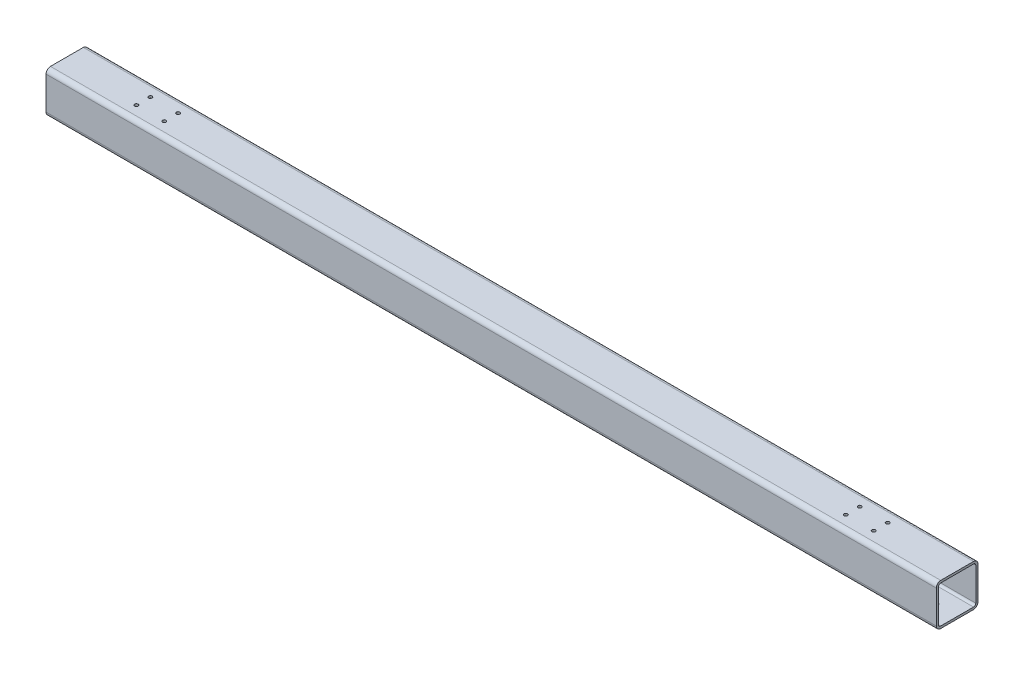
ISO-10303-21;
HEADER;
FILE_DESCRIPTION(('STEP AP214'),'2;1');
FILE_NAME('part.step','',(''),(''),'','','');
FILE_SCHEMA(('AUTOMOTIVE_DESIGN { 1 0 10303 214 1 1 1 1 }'));
ENDSEC;
DATA;
#1=APPLICATION_CONTEXT('core data for automotive mechanical design processes');
#2=APPLICATION_PROTOCOL_DEFINITION('international standard','automotive_design',2000,#1);
#3=PRODUCT_CONTEXT('',#1,'mechanical');
#4=PRODUCT('Part','Part','',(#3));
#5=PRODUCT_RELATED_PRODUCT_CATEGORY('part','',(#4));
#6=PRODUCT_DEFINITION_FORMATION('','',#4);
#7=PRODUCT_DEFINITION_CONTEXT('part definition',#1,'design');
#8=PRODUCT_DEFINITION('design','',#6,#7);
#9=PRODUCT_DEFINITION_SHAPE('','',#8);
#10=(LENGTH_UNIT() NAMED_UNIT(*) SI_UNIT(.MILLI.,.METRE.));
#11=(NAMED_UNIT(*) PLANE_ANGLE_UNIT() SI_UNIT($,.RADIAN.));
#12=(NAMED_UNIT(*) SI_UNIT($,.STERADIAN.) SOLID_ANGLE_UNIT());
#13=UNCERTAINTY_MEASURE_WITH_UNIT(LENGTH_MEASURE(1.E-05),#10,'distance_accuracy_value','');
#14=(GEOMETRIC_REPRESENTATION_CONTEXT(3) GLOBAL_UNCERTAINTY_ASSIGNED_CONTEXT((#13)) GLOBAL_UNIT_ASSIGNED_CONTEXT((#10,
#11,#12)) REPRESENTATION_CONTEXT('',''));
#15=CARTESIAN_POINT('',(0.,0.,0.));
#16=DIRECTION('',(0.,0.,1.));
#17=DIRECTION('',(1.,0.,0.));
#18=AXIS2_PLACEMENT_3D('',#15,#16,#17);
#19=CARTESIAN_POINT('',(-479.999999999999,30.,-1193.6));
#20=DIRECTION('',(0.,1.,0.));
#21=DIRECTION('',(0.,0.,1.));
#22=AXIS2_PLACEMENT_3D('',#19,#20,#21);
#23=PLANE('',#22);
#24=CARTESIAN_POINT('',(-489.999999999999,30.,-1160.));
#25=DIRECTION('',(0.,1.,0.));
#26=DIRECTION('',(0.,0.,1.));
#27=AXIS2_PLACEMENT_3D('',#24,#25,#26);
#28=CIRCLE('',#27,2.49999999999995);
#29=CARTESIAN_POINT('',(-489.999999999999,30.,-1157.5));
#30=VERTEX_POINT('',#29);
#31=EDGE_CURVE('E19',#30,#30,#28,.F.);
#32=ORIENTED_EDGE('',*,*,#31,.T.);
#33=EDGE_LOOP('',(#32));
#34=FACE_BOUND('',#33,.T.);
#35=CARTESIAN_POINT('',(-529.999999999999,30.,-1180.));
#36=DIRECTION('',(0.,1.,0.));
#37=DIRECTION('',(0.,0.,1.));
#38=AXIS2_PLACEMENT_3D('',#35,#36,#37);
#39=CIRCLE('',#38,2.49999999999995);
#40=CARTESIAN_POINT('',(-529.999999999999,30.,-1177.5));
#41=VERTEX_POINT('',#40);
#42=EDGE_CURVE('E249',#41,#41,#39,.F.);
#43=ORIENTED_EDGE('',*,*,#42,.T.);
#44=EDGE_LOOP('',(#43));
#45=FACE_BOUND('',#44,.T.);
#46=DIRECTION('',(0.,0.,1.));
#47=VECTOR('',#46,1.);
#48=CARTESIAN_POINT('',(-640.,30.,1170.));
#49=LINE('',#48,#47);
#50=CARTESIAN_POINT('',(-640.,30.,-1146.4));
#51=VERTEX_POINT('',#50);
#52=CARTESIAN_POINT('',(-640.,30.,-1193.6));
#53=VERTEX_POINT('',#52);
#54=EDGE_CURVE('E182',#51,#53,#49,.F.);
#55=ORIENTED_EDGE('',*,*,#54,.F.);
#56=DIRECTION('',(-1.,0.,0.));
#57=VECTOR('',#56,1.);
#58=CARTESIAN_POINT('',(670.,30.,-1146.4));
#59=LINE('',#58,#57);
#60=CARTESIAN_POINT('',(640.,30.,-1146.4));
#61=VERTEX_POINT('',#60);
#62=EDGE_CURVE('E234',#61,#51,#59,.T.);
#63=ORIENTED_EDGE('',*,*,#62,.F.);
#64=DIRECTION('',(0.,0.,-1.));
#65=VECTOR('',#64,1.);
#66=CARTESIAN_POINT('',(640.,30.,1170.));
#67=LINE('',#66,#65);
#68=CARTESIAN_POINT('',(640.,30.,-1193.6));
#69=VERTEX_POINT('',#68);
#70=EDGE_CURVE('E233',#69,#61,#67,.F.);
#71=ORIENTED_EDGE('',*,*,#70,.F.);
#72=DIRECTION('',(-1.,0.,0.));
#73=VECTOR('',#72,1.);
#74=CARTESIAN_POINT('',(670.,30.,-1193.6));
#75=LINE('',#74,#73);
#76=EDGE_CURVE('E404',#53,#69,#75,.F.);
#77=ORIENTED_EDGE('',*,*,#76,.F.);
#78=EDGE_LOOP('',(#55,#63,#71,#77));
#79=FACE_BOUND('',#78,.T.);
#80=CARTESIAN_POINT('',(-529.999999999999,30.,-1160.));
#81=DIRECTION('',(0.,1.,0.));
#82=DIRECTION('',(0.,0.,1.));
#83=AXIS2_PLACEMENT_3D('',#80,#81,#82);
#84=CIRCLE('',#83,2.49999999999995);
#85=CARTESIAN_POINT('',(-529.999999999999,30.,-1157.5));
#86=VERTEX_POINT('',#85);
#87=EDGE_CURVE('E246',#86,#86,#84,.F.);
#88=ORIENTED_EDGE('',*,*,#87,.T.);
#89=EDGE_LOOP('',(#88));
#90=FACE_BOUND('',#89,.T.);
#91=CARTESIAN_POINT('',(-489.999999999999,30.,-1180.));
#92=DIRECTION('',(0.,1.,0.));
#93=DIRECTION('',(0.,0.,1.));
#94=AXIS2_PLACEMENT_3D('',#91,#92,#93);
#95=CIRCLE('',#94,2.49999999999995);
#96=CARTESIAN_POINT('',(-489.999999999999,30.,-1177.5));
#97=VERTEX_POINT('',#96);
#98=EDGE_CURVE('E252',#97,#97,#95,.F.);
#99=ORIENTED_EDGE('',*,*,#98,.T.);
#100=EDGE_LOOP('',(#99));
#101=FACE_BOUND('',#100,.T.);
#102=CARTESIAN_POINT('',(529.999999999998,30.0000000000001,-1180.));
#103=DIRECTION('',(0.,1.,0.));
#104=DIRECTION('',(0.,0.,1.));
#105=AXIS2_PLACEMENT_3D('',#102,#103,#104);
#106=CIRCLE('',#105,2.49999999999995);
#107=CARTESIAN_POINT('',(529.999999999998,30.0000000000001,-1177.5));
#108=VERTEX_POINT('',#107);
#109=EDGE_CURVE('E244',#108,#108,#106,.F.);
#110=ORIENTED_EDGE('',*,*,#109,.T.);
#111=EDGE_LOOP('',(#110));
#112=FACE_BOUND('',#111,.T.);
#113=CARTESIAN_POINT('',(489.999999999998,30.0000000000001,-1160.));
#114=DIRECTION('',(0.,1.,0.));
#115=DIRECTION('',(0.,0.,1.));
#116=AXIS2_PLACEMENT_3D('',#113,#114,#115);
#117=CIRCLE('',#116,2.49999999999995);
#118=CARTESIAN_POINT('',(489.999999999998,30.0000000000001,-1157.5));
#119=VERTEX_POINT('',#118);
#120=EDGE_CURVE('E296',#119,#119,#117,.F.);
#121=ORIENTED_EDGE('',*,*,#120,.T.);
#122=EDGE_LOOP('',(#121));
#123=FACE_BOUND('',#122,.T.);
#124=CARTESIAN_POINT('',(529.999999999998,30.0000000000001,-1160.));
#125=DIRECTION('',(0.,1.,0.));
#126=DIRECTION('',(0.,0.,1.));
#127=AXIS2_PLACEMENT_3D('',#124,#125,#126);
#128=CIRCLE('',#127,2.49999999999995);
#129=CARTESIAN_POINT('',(529.999999999998,30.0000000000001,-1157.5));
#130=VERTEX_POINT('',#129);
#131=EDGE_CURVE('E250',#130,#130,#128,.F.);
#132=ORIENTED_EDGE('',*,*,#131,.T.);
#133=EDGE_LOOP('',(#132));
#134=FACE_BOUND('',#133,.T.);
#135=CARTESIAN_POINT('',(489.999999999998,30.0000000000001,-1180.));
#136=DIRECTION('',(0.,1.,0.));
#137=DIRECTION('',(0.,0.,1.));
#138=AXIS2_PLACEMENT_3D('',#135,#136,#137);
#139=CIRCLE('',#138,2.49999999999995);
#140=CARTESIAN_POINT('',(489.999999999998,30.0000000000001,-1177.5));
#141=VERTEX_POINT('',#140);
#142=EDGE_CURVE('E299',#141,#141,#139,.F.);
#143=ORIENTED_EDGE('',*,*,#142,.T.);
#144=EDGE_LOOP('',(#143));
#145=FACE_BOUND('',#144,.T.);
#146=ADVANCED_FACE('F15',(#34,#45,#79,#90,#101,#112,#123,#134,#145),#23,.T.);
#147=CARTESIAN_POINT('',(-538.999999999999,-29.999999999859,-1170.));
#148=DIRECTION('',(0.,-1.,0.));
#149=DIRECTION('',(1.,0.,0.));
#150=AXIS2_PLACEMENT_3D('',#147,#148,#149);
#151=CONICAL_SURFACE('',#150,3.99999999980771,1.02974425860685);
#152=CARTESIAN_POINT('',(-538.999999999999,-27.5965575237933,-1170.00000000019));
#153=VERTEX_POINT('',#152);
#154=VERTEX_LOOP('',#153);
#155=FACE_BOUND('',#154,.T.);
#156=CARTESIAN_POINT('',(-538.999999999999,-29.999999999986,-1170.));
#157=DIRECTION('',(0.,-1.,0.));
#158=DIRECTION('',(1.,0.,0.));
#159=AXIS2_PLACEMENT_3D('',#156,#157,#158);
#160=CIRCLE('',#159,4.0000000000191);
#161=CARTESIAN_POINT('',(-534.99999999998,-29.999999999986,-1170.));
#162=VERTEX_POINT('',#161);
#163=EDGE_CURVE('E363',#162,#162,#160,.T.);
#164=ORIENTED_EDGE('',*,*,#163,.T.);
#165=EDGE_LOOP('',(#164));
#166=FACE_BOUND('',#165,.T.);
#167=ADVANCED_FACE('F483',(#155,#166),#151,.F.);
#168=CARTESIAN_POINT('',(538.999999999999,-29.999999999859,-1170.));
#169=DIRECTION('',(0.,-1.,0.));
#170=DIRECTION('',(1.,0.,0.));
#171=AXIS2_PLACEMENT_3D('',#168,#169,#170);
#172=CONICAL_SURFACE('',#171,3.99999999980771,1.02974425860685);
#173=CARTESIAN_POINT('',(538.999999999999,-27.5965575237933,-1170.00000000019));
#174=VERTEX_POINT('',#173);
#175=VERTEX_LOOP('',#174);
#176=FACE_BOUND('',#175,.T.);
#177=CARTESIAN_POINT('',(538.999999999999,-29.999999999986,-1170.));
#178=DIRECTION('',(0.,-1.,0.));
#179=DIRECTION('',(1.,0.,0.));
#180=AXIS2_PLACEMENT_3D('',#177,#178,#179);
#181=CIRCLE('',#180,4.0000000000191);
#182=CARTESIAN_POINT('',(543.000000000018,-29.999999999986,-1170.));
#183=VERTEX_POINT('',#182);
#184=EDGE_CURVE('E368',#183,#183,#181,.T.);
#185=ORIENTED_EDGE('',*,*,#184,.T.);
#186=EDGE_LOOP('',(#185));
#187=FACE_BOUND('',#186,.T.);
#188=ADVANCED_FACE('F485',(#176,#187),#172,.F.);
#189=CARTESIAN_POINT('',(-609.,-40.,-1170.));
#190=DIRECTION('',(0.,-1.,0.));
#191=DIRECTION('',(0.,0.,-1.));
#192=AXIS2_PLACEMENT_3D('',#189,#190,#191);
#193=CYLINDRICAL_SURFACE('',#192,3.39999999999985);
#194=CARTESIAN_POINT('',(-609.,-30.,-1170.));
#195=DIRECTION('',(0.,-1.,0.));
#196=DIRECTION('',(0.,0.,-1.));
#197=AXIS2_PLACEMENT_3D('',#194,#195,#196);
#198=CIRCLE('',#197,3.39999999999985);
#199=CARTESIAN_POINT('',(-609.,-30.,-1173.4));
#200=VERTEX_POINT('',#199);
#201=EDGE_CURVE('E372',#200,#200,#198,.T.);
#202=ORIENTED_EDGE('',*,*,#201,.T.);
#203=EDGE_LOOP('',(#202));
#204=FACE_BOUND('',#203,.T.);
#205=CARTESIAN_POINT('',(-609.,-26.7999999999999,-1170.));
#206=DIRECTION('',(0.,-1.,0.));
#207=DIRECTION('',(0.,0.,-1.));
#208=AXIS2_PLACEMENT_3D('',#205,#206,#207);
#209=CIRCLE('',#208,3.39999999999985);
#210=CARTESIAN_POINT('',(-609.,-26.7999999999999,-1173.4));
#211=VERTEX_POINT('',#210);
#212=EDGE_CURVE('E346',#211,#211,#209,.T.);
#213=ORIENTED_EDGE('',*,*,#212,.F.);
#214=EDGE_LOOP('',(#213));
#215=FACE_BOUND('',#214,.T.);
#216=ADVANCED_FACE('F491',(#204,#215),#193,.F.);
#217=CARTESIAN_POINT('',(-469.,-40.,-1170.));
#218=DIRECTION('',(0.,-1.,0.));
#219=DIRECTION('',(0.,0.,-1.));
#220=AXIS2_PLACEMENT_3D('',#217,#218,#219);
#221=CYLINDRICAL_SURFACE('',#220,3.40000000000007);
#222=CARTESIAN_POINT('',(-469.,-30.,-1170.));
#223=DIRECTION('',(0.,-1.,0.));
#224=DIRECTION('',(0.,0.,-1.));
#225=AXIS2_PLACEMENT_3D('',#222,#223,#224);
#226=CIRCLE('',#225,3.40000000000007);
#227=CARTESIAN_POINT('',(-469.,-30.,-1173.4));
#228=VERTEX_POINT('',#227);
#229=EDGE_CURVE('E376',#228,#228,#226,.T.);
#230=ORIENTED_EDGE('',*,*,#229,.T.);
#231=EDGE_LOOP('',(#230));
#232=FACE_BOUND('',#231,.T.);
#233=CARTESIAN_POINT('',(-469.,-26.7999999999999,-1170.));
#234=DIRECTION('',(0.,-1.,0.));
#235=DIRECTION('',(0.,0.,-1.));
#236=AXIS2_PLACEMENT_3D('',#233,#234,#235);
#237=CIRCLE('',#236,3.40000000000007);
#238=CARTESIAN_POINT('',(-469.,-26.7999999999999,-1173.4));
#239=VERTEX_POINT('',#238);
#240=EDGE_CURVE('E351',#239,#239,#237,.T.);
#241=ORIENTED_EDGE('',*,*,#240,.F.);
#242=EDGE_LOOP('',(#241));
#243=FACE_BOUND('',#242,.T.);
#244=ADVANCED_FACE('F502',(#232,#243),#221,.F.);
#245=CARTESIAN_POINT('',(469.,-40.,-1170.));
#246=DIRECTION('',(0.,-1.,0.));
#247=DIRECTION('',(0.,0.,-1.));
#248=AXIS2_PLACEMENT_3D('',#245,#246,#247);
#249=CYLINDRICAL_SURFACE('',#248,3.40000000000007);
#250=CARTESIAN_POINT('',(469.,-30.,-1170.));
#251=DIRECTION('',(0.,-1.,0.));
#252=DIRECTION('',(0.,0.,-1.));
#253=AXIS2_PLACEMENT_3D('',#250,#251,#252);
#254=CIRCLE('',#253,3.40000000000007);
#255=CARTESIAN_POINT('',(469.,-30.,-1173.4));
#256=VERTEX_POINT('',#255);
#257=EDGE_CURVE('E379',#256,#256,#254,.T.);
#258=ORIENTED_EDGE('',*,*,#257,.T.);
#259=EDGE_LOOP('',(#258));
#260=FACE_BOUND('',#259,.T.);
#261=CARTESIAN_POINT('',(469.,-26.7999999999999,-1170.));
#262=DIRECTION('',(0.,-1.,0.));
#263=DIRECTION('',(0.,0.,-1.));
#264=AXIS2_PLACEMENT_3D('',#261,#262,#263);
#265=CIRCLE('',#264,3.40000000000007);
#266=CARTESIAN_POINT('',(469.,-26.7999999999999,-1173.4));
#267=VERTEX_POINT('',#266);
#268=EDGE_CURVE('E355',#267,#267,#265,.T.);
#269=ORIENTED_EDGE('',*,*,#268,.F.);
#270=EDGE_LOOP('',(#269));
#271=FACE_BOUND('',#270,.T.);
#272=ADVANCED_FACE('F506',(#260,#271),#249,.F.);
#273=CARTESIAN_POINT('',(609.,-40.,-1170.));
#274=DIRECTION('',(0.,-1.,0.));
#275=DIRECTION('',(0.,0.,-1.));
#276=AXIS2_PLACEMENT_3D('',#273,#274,#275);
#277=CYLINDRICAL_SURFACE('',#276,3.40000000000007);
#278=CARTESIAN_POINT('',(609.,-30.,-1170.));
#279=DIRECTION('',(0.,-1.,0.));
#280=DIRECTION('',(0.,0.,-1.));
#281=AXIS2_PLACEMENT_3D('',#278,#279,#280);
#282=CIRCLE('',#281,3.40000000000007);
#283=CARTESIAN_POINT('',(609.,-30.,-1173.4));
#284=VERTEX_POINT('',#283);
#285=EDGE_CURVE('E163',#284,#284,#282,.T.);
#286=ORIENTED_EDGE('',*,*,#285,.T.);
#287=EDGE_LOOP('',(#286));
#288=FACE_BOUND('',#287,.T.);
#289=CARTESIAN_POINT('',(609.,-26.7999999999999,-1170.));
#290=DIRECTION('',(0.,-1.,0.));
#291=DIRECTION('',(0.,0.,-1.));
#292=AXIS2_PLACEMENT_3D('',#289,#290,#291);
#293=CIRCLE('',#292,3.40000000000007);
#294=CARTESIAN_POINT('',(609.,-26.7999999999999,-1173.4));
#295=VERTEX_POINT('',#294);
#296=EDGE_CURVE('E359',#295,#295,#293,.T.);
#297=ORIENTED_EDGE('',*,*,#296,.F.);
#298=EDGE_LOOP('',(#297));
#299=FACE_BOUND('',#298,.T.);
#300=ADVANCED_FACE('F510',(#288,#299),#277,.F.);
#301=CARTESIAN_POINT('',(670.,-23.6000000000001,-1146.4));
#302=DIRECTION('',(-1.,0.,0.));
#303=DIRECTION('',(0.,0.,1.));
#304=AXIS2_PLACEMENT_3D('',#301,#302,#303);
#305=CYLINDRICAL_SURFACE('',#304,3.19999999999987);
#306=CARTESIAN_POINT('',(-640.,-23.6000000000001,-1146.4));
#307=DIRECTION('',(-1.,0.,0.));
#308=DIRECTION('',(0.,0.,1.));
#309=AXIS2_PLACEMENT_3D('',#306,#307,#308);
#310=CIRCLE('',#309,3.19999999999987);
#311=CARTESIAN_POINT('',(-640.,-23.6000000000001,-1143.2));
#312=VERTEX_POINT('',#311);
#313=CARTESIAN_POINT('',(-640.,-26.7999999999999,-1146.4));
#314=VERTEX_POINT('',#313);
#315=EDGE_CURVE('E133',#312,#314,#310,.F.);
#316=ORIENTED_EDGE('',*,*,#315,.F.);
#317=DIRECTION('',(1.,0.,0.));
#318=VECTOR('',#317,1.);
#319=CARTESIAN_POINT('',(670.,-23.6000000000001,-1143.2));
#320=LINE('',#319,#318);
#321=CARTESIAN_POINT('',(640.,-23.6000000000001,-1143.2));
#322=VERTEX_POINT('',#321);
#323=EDGE_CURVE('E271',#322,#312,#320,.F.);
#324=ORIENTED_EDGE('',*,*,#323,.F.);
#325=CARTESIAN_POINT('',(640.,-23.6000000000001,-1146.4));
#326=DIRECTION('',(-1.,0.,0.));
#327=DIRECTION('',(0.,0.,1.));
#328=AXIS2_PLACEMENT_3D('',#325,#326,#327);
#329=CIRCLE('',#328,3.19999999999987);
#330=CARTESIAN_POINT('',(640.,-26.7999999999999,-1146.4));
#331=VERTEX_POINT('',#330);
#332=EDGE_CURVE('E136',#331,#322,#329,.T.);
#333=ORIENTED_EDGE('',*,*,#332,.F.);
#334=DIRECTION('',(-1.,0.,0.));
#335=VECTOR('',#334,1.);
#336=CARTESIAN_POINT('',(670.,-26.7999999999999,-1146.4));
#337=LINE('',#336,#335);
#338=EDGE_CURVE('E129',#314,#331,#337,.F.);
#339=ORIENTED_EDGE('',*,*,#338,.F.);
#340=EDGE_LOOP('',(#316,#324,#333,#339));
#341=FACE_BOUND('',#340,.T.);
#342=ADVANCED_FACE('F131',(#341),#305,.F.);
#343=CARTESIAN_POINT('',(670.,-26.7999999999999,-1146.4));
#344=DIRECTION('',(0.,1.,0.));
#345=DIRECTION('',(0.,0.,1.));
#346=AXIS2_PLACEMENT_3D('',#343,#344,#345);
#347=PLANE('',#346);
#348=ORIENTED_EDGE('',*,*,#338,.T.);
#349=DIRECTION('',(0.,0.,-1.));
#350=VECTOR('',#349,1.);
#351=CARTESIAN_POINT('',(640.,-26.7999999999999,1170.));
#352=LINE('',#351,#350);
#353=CARTESIAN_POINT('',(640.,-26.7999999999999,-1193.6));
#354=VERTEX_POINT('',#353);
#355=EDGE_CURVE('E207',#354,#331,#352,.F.);
#356=ORIENTED_EDGE('',*,*,#355,.F.);
#357=DIRECTION('',(1.,0.,0.));
#358=VECTOR('',#357,1.);
#359=CARTESIAN_POINT('',(670.,-26.7999999999999,-1193.6));
#360=LINE('',#359,#358);
#361=CARTESIAN_POINT('',(-640.,-26.7999999999999,-1193.6));
#362=VERTEX_POINT('',#361);
#363=EDGE_CURVE('E147',#354,#362,#360,.F.);
#364=ORIENTED_EDGE('',*,*,#363,.T.);
#365=DIRECTION('',(0.,0.,1.));
#366=VECTOR('',#365,1.);
#367=CARTESIAN_POINT('',(-640.,-26.7999999999999,1170.));
#368=LINE('',#367,#366);
#369=EDGE_CURVE('E144',#314,#362,#368,.F.);
#370=ORIENTED_EDGE('',*,*,#369,.F.);
#371=EDGE_LOOP('',(#348,#356,#364,#370));
#372=FACE_BOUND('',#371,.T.);
#373=ORIENTED_EDGE('',*,*,#296,.T.);
#374=EDGE_LOOP('',(#373));
#375=FACE_BOUND('',#374,.T.);
#376=ORIENTED_EDGE('',*,*,#268,.T.);
#377=EDGE_LOOP('',(#376));
#378=FACE_BOUND('',#377,.T.);
#379=ORIENTED_EDGE('',*,*,#240,.T.);
#380=EDGE_LOOP('',(#379));
#381=FACE_BOUND('',#380,.T.);
#382=ORIENTED_EDGE('',*,*,#212,.T.);
#383=EDGE_LOOP('',(#382));
#384=FACE_BOUND('',#383,.T.);
#385=ADVANCED_FACE('F145',(#372,#375,#378,#381,#384),#347,.T.);
#386=CARTESIAN_POINT('',(670.,-23.6000000000001,-1193.6));
#387=DIRECTION('',(-1.,0.,0.));
#388=DIRECTION('',(0.,0.,1.));
#389=AXIS2_PLACEMENT_3D('',#386,#387,#388);
#390=CYLINDRICAL_SURFACE('',#389,3.20000000000009);
#391=CARTESIAN_POINT('',(-640.,-23.6000000000001,-1193.6));
#392=DIRECTION('',(-1.,0.,0.));
#393=DIRECTION('',(0.,0.,1.));
#394=AXIS2_PLACEMENT_3D('',#391,#392,#393);
#395=CIRCLE('',#394,3.20000000000009);
#396=CARTESIAN_POINT('',(-640.,-23.6000000000001,-1196.8));
#397=VERTEX_POINT('',#396);
#398=EDGE_CURVE('E152',#362,#397,#395,.F.);
#399=ORIENTED_EDGE('',*,*,#398,.F.);
#400=ORIENTED_EDGE('',*,*,#363,.F.);
#401=CARTESIAN_POINT('',(640.,-23.6000000000001,-1193.6));
#402=DIRECTION('',(-1.,0.,0.));
#403=DIRECTION('',(0.,0.,1.));
#404=AXIS2_PLACEMENT_3D('',#401,#402,#403);
#405=CIRCLE('',#404,3.20000000000009);
#406=CARTESIAN_POINT('',(640.,-23.6000000000001,-1196.8));
#407=VERTEX_POINT('',#406);
#408=EDGE_CURVE('E203',#407,#354,#405,.T.);
#409=ORIENTED_EDGE('',*,*,#408,.F.);
#410=DIRECTION('',(-1.,0.,0.));
#411=VECTOR('',#410,1.);
#412=CARTESIAN_POINT('',(670.,-23.6000000000001,-1196.8));
#413=LINE('',#412,#411);
#414=EDGE_CURVE('E350',#397,#407,#413,.F.);
#415=ORIENTED_EDGE('',*,*,#414,.F.);
#416=EDGE_LOOP('',(#399,#400,#409,#415));
#417=FACE_BOUND('',#416,.T.);
#418=ADVANCED_FACE('F432',(#417),#390,.F.);
#419=CARTESIAN_POINT('',(670.,23.6000000000001,-1196.8));
#420=DIRECTION('',(0.,0.,1.));
#421=DIRECTION('',(1.,0.,0.));
#422=AXIS2_PLACEMENT_3D('',#419,#420,#421);
#423=PLANE('',#422);
#424=ORIENTED_EDGE('',*,*,#414,.T.);
#425=DIRECTION('',(0.,1.,0.));
#426=VECTOR('',#425,1.);
#427=CARTESIAN_POINT('',(640.,-23.6000000000001,-1196.8));
#428=LINE('',#427,#426);
#429=CARTESIAN_POINT('',(640.,23.6000000000001,-1196.8));
#430=VERTEX_POINT('',#429);
#431=EDGE_CURVE('E202',#430,#407,#428,.F.);
#432=ORIENTED_EDGE('',*,*,#431,.F.);
#433=DIRECTION('',(1.,0.,0.));
#434=VECTOR('',#433,1.);
#435=CARTESIAN_POINT('',(670.,23.6000000000001,-1196.8));
#436=LINE('',#435,#434);
#437=CARTESIAN_POINT('',(-640.,23.6000000000001,-1196.8));
#438=VERTEX_POINT('',#437);
#439=EDGE_CURVE('E807',#430,#438,#436,.F.);
#440=ORIENTED_EDGE('',*,*,#439,.T.);
#441=DIRECTION('',(0.,1.,0.));
#442=VECTOR('',#441,1.);
#443=CARTESIAN_POINT('',(-640.,23.6000000000001,-1196.8));
#444=LINE('',#443,#442);
#445=EDGE_CURVE('E167',#397,#438,#444,.T.);
#446=ORIENTED_EDGE('',*,*,#445,.F.);
#447=EDGE_LOOP('',(#424,#432,#440,#446));
#448=FACE_BOUND('',#447,.T.);
#449=ADVANCED_FACE('F521',(#448),#423,.T.);
#450=CARTESIAN_POINT('',(670.,23.6000000000001,-1193.6));
#451=DIRECTION('',(-1.,0.,0.));
#452=DIRECTION('',(0.,0.,1.));
#453=AXIS2_PLACEMENT_3D('',#450,#451,#452);
#454=CYLINDRICAL_SURFACE('',#453,3.20000000000009);
#455=CARTESIAN_POINT('',(-640.,23.6000000000001,-1193.6));
#456=DIRECTION('',(-1.,0.,0.));
#457=DIRECTION('',(0.,0.,1.));
#458=AXIS2_PLACEMENT_3D('',#455,#456,#457);
#459=CIRCLE('',#458,3.20000000000009);
#460=CARTESIAN_POINT('',(-640.,26.8,-1193.6));
#461=VERTEX_POINT('',#460);
#462=EDGE_CURVE('E168',#438,#461,#459,.F.);
#463=ORIENTED_EDGE('',*,*,#462,.F.);
#464=ORIENTED_EDGE('',*,*,#439,.F.);
#465=CARTESIAN_POINT('',(640.,23.6000000000001,-1193.6));
#466=DIRECTION('',(-1.,0.,0.));
#467=DIRECTION('',(0.,0.,1.));
#468=AXIS2_PLACEMENT_3D('',#465,#466,#467);
#469=CIRCLE('',#468,3.20000000000009);
#470=CARTESIAN_POINT('',(640.,26.8,-1193.6));
#471=VERTEX_POINT('',#470);
#472=EDGE_CURVE('E198',#471,#430,#469,.T.);
#473=ORIENTED_EDGE('',*,*,#472,.F.);
#474=DIRECTION('',(-1.,0.,0.));
#475=VECTOR('',#474,1.);
#476=CARTESIAN_POINT('',(670.,26.8000000000002,-1193.6));
#477=LINE('',#476,#475);
#478=EDGE_CURVE('E345',#461,#471,#477,.F.);
#479=ORIENTED_EDGE('',*,*,#478,.F.);
#480=EDGE_LOOP('',(#463,#464,#473,#479));
#481=FACE_BOUND('',#480,.T.);
#482=ADVANCED_FACE('F517',(#481),#454,.F.);
#483=CARTESIAN_POINT('',(670.,26.7999999999999,-1193.6));
#484=DIRECTION('',(0.,-1.,0.));
#485=DIRECTION('',(0.,0.,-1.));
#486=AXIS2_PLACEMENT_3D('',#483,#484,#485);
#487=PLANE('',#486);
#488=ORIENTED_EDGE('',*,*,#478,.T.);
#489=DIRECTION('',(0.,0.,-1.));
#490=VECTOR('',#489,1.);
#491=CARTESIAN_POINT('',(640.,26.7999999999999,1170.));
#492=LINE('',#491,#490);
#493=CARTESIAN_POINT('',(640.,26.8,-1146.4));
#494=VERTEX_POINT('',#493);
#495=EDGE_CURVE('E197',#494,#471,#492,.T.);
#496=ORIENTED_EDGE('',*,*,#495,.F.);
#497=DIRECTION('',(-1.,0.,0.));
#498=VECTOR('',#497,1.);
#499=CARTESIAN_POINT('',(670.,26.8000000000002,-1146.4));
#500=LINE('',#499,#498);
#501=CARTESIAN_POINT('',(-640.,26.8,-1146.4));
#502=VERTEX_POINT('',#501);
#503=EDGE_CURVE('E196',#494,#502,#500,.T.);
#504=ORIENTED_EDGE('',*,*,#503,.T.);
#505=DIRECTION('',(0.,0.,1.));
#506=VECTOR('',#505,1.);
#507=CARTESIAN_POINT('',(-640.,26.7999999999999,1170.));
#508=LINE('',#507,#506);
#509=EDGE_CURVE('E172',#461,#502,#508,.T.);
#510=ORIENTED_EDGE('',*,*,#509,.F.);
#511=EDGE_LOOP('',(#488,#496,#504,#510));
#512=FACE_BOUND('',#511,.T.);
#513=CARTESIAN_POINT('',(-529.999999999999,26.8,-1160.));
#514=DIRECTION('',(0.,1.,0.));
#515=DIRECTION('',(0.,0.,1.));
#516=AXIS2_PLACEMENT_3D('',#513,#514,#515);
#517=CIRCLE('',#516,2.49999999999995);
#518=CARTESIAN_POINT('',(-529.999999999999,26.8,-1157.5));
#519=VERTEX_POINT('',#518);
#520=EDGE_CURVE('E341',#519,#519,#517,.T.);
#521=ORIENTED_EDGE('',*,*,#520,.T.);
#522=EDGE_LOOP('',(#521));
#523=FACE_BOUND('',#522,.T.);
#524=CARTESIAN_POINT('',(529.999999999998,26.8,-1160.));
#525=DIRECTION('',(0.,1.,0.));
#526=DIRECTION('',(0.,0.,1.));
#527=AXIS2_PLACEMENT_3D('',#524,#525,#526);
#528=CIRCLE('',#527,2.49999999999995);
#529=CARTESIAN_POINT('',(529.999999999998,26.8,-1157.5));
#530=VERTEX_POINT('',#529);
#531=EDGE_CURVE('E337',#530,#530,#528,.T.);
#532=ORIENTED_EDGE('',*,*,#531,.T.);
#533=EDGE_LOOP('',(#532));
#534=FACE_BOUND('',#533,.T.);
#535=CARTESIAN_POINT('',(489.999999999998,26.8,-1160.));
#536=DIRECTION('',(0.,1.,0.));
#537=DIRECTION('',(0.,0.,1.));
#538=AXIS2_PLACEMENT_3D('',#535,#536,#537);
#539=CIRCLE('',#538,2.49999999999995);
#540=CARTESIAN_POINT('',(489.999999999998,26.8,-1157.5));
#541=VERTEX_POINT('',#540);
#542=EDGE_CURVE('E330',#541,#541,#539,.T.);
#543=ORIENTED_EDGE('',*,*,#542,.T.);
#544=EDGE_LOOP('',(#543));
#545=FACE_BOUND('',#544,.T.);
#546=CARTESIAN_POINT('',(489.999999999998,26.8,-1180.));
#547=DIRECTION('',(0.,1.,0.));
#548=DIRECTION('',(0.,0.,1.));
#549=AXIS2_PLACEMENT_3D('',#546,#547,#548);
#550=CIRCLE('',#549,2.49999999999995);
#551=CARTESIAN_POINT('',(489.999999999998,26.8,-1177.5));
#552=VERTEX_POINT('',#551);
#553=EDGE_CURVE('E323',#552,#552,#550,.T.);
#554=ORIENTED_EDGE('',*,*,#553,.T.);
#555=EDGE_LOOP('',(#554));
#556=FACE_BOUND('',#555,.T.);
#557=CARTESIAN_POINT('',(529.999999999998,26.8,-1180.));
#558=DIRECTION('',(0.,1.,0.));
#559=DIRECTION('',(0.,0.,1.));
#560=AXIS2_PLACEMENT_3D('',#557,#558,#559);
#561=CIRCLE('',#560,2.49999999999995);
#562=CARTESIAN_POINT('',(529.999999999998,26.8,-1177.5));
#563=VERTEX_POINT('',#562);
#564=EDGE_CURVE('E319',#563,#563,#561,.T.);
#565=ORIENTED_EDGE('',*,*,#564,.T.);
#566=EDGE_LOOP('',(#565));
#567=FACE_BOUND('',#566,.T.);
#568=CARTESIAN_POINT('',(-529.999999999999,26.8,-1180.));
#569=DIRECTION('',(0.,1.,0.));
#570=DIRECTION('',(0.,0.,1.));
#571=AXIS2_PLACEMENT_3D('',#568,#569,#570);
#572=CIRCLE('',#571,2.49999999999995);
#573=CARTESIAN_POINT('',(-529.999999999999,26.8,-1177.5));
#574=VERTEX_POINT('',#573);
#575=EDGE_CURVE('E322',#574,#574,#572,.T.);
#576=ORIENTED_EDGE('',*,*,#575,.T.);
#577=EDGE_LOOP('',(#576));
#578=FACE_BOUND('',#577,.T.);
#579=CARTESIAN_POINT('',(-489.999999999999,26.8,-1180.));
#580=DIRECTION('',(0.,1.,0.));
#581=DIRECTION('',(0.,0.,1.));
#582=AXIS2_PLACEMENT_3D('',#579,#580,#581);
#583=CIRCLE('',#582,2.49999999999995);
#584=CARTESIAN_POINT('',(-489.999999999999,26.8,-1177.5));
#585=VERTEX_POINT('',#584);
#586=EDGE_CURVE('E26',#585,#585,#583,.T.);
#587=ORIENTED_EDGE('',*,*,#586,.T.);
#588=EDGE_LOOP('',(#587));
#589=FACE_BOUND('',#588,.T.);
#590=CARTESIAN_POINT('',(-489.999999999999,26.8,-1160.));
#591=DIRECTION('',(0.,1.,0.));
#592=DIRECTION('',(0.,0.,1.));
#593=AXIS2_PLACEMENT_3D('',#590,#591,#592);
#594=CIRCLE('',#593,2.49999999999995);
#595=CARTESIAN_POINT('',(-489.999999999999,26.8,-1157.5));
#596=VERTEX_POINT('',#595);
#597=EDGE_CURVE('E10',#596,#596,#594,.T.);
#598=ORIENTED_EDGE('',*,*,#597,.T.);
#599=EDGE_LOOP('',(#598));
#600=FACE_BOUND('',#599,.T.);
#601=ADVANCED_FACE('F513',(#512,#523,#534,#545,#556,#567,#578,#589,#600),#487,.T.);
#602=CARTESIAN_POINT('',(670.,23.6000000000001,-1146.4));
#603=DIRECTION('',(-1.,0.,0.));
#604=DIRECTION('',(0.,0.,1.));
#605=AXIS2_PLACEMENT_3D('',#602,#603,#604);
#606=CYLINDRICAL_SURFACE('',#605,3.20000000000009);
#607=CARTESIAN_POINT('',(-640.,23.6000000000001,-1146.4));
#608=DIRECTION('',(-1.,0.,0.));
#609=DIRECTION('',(0.,0.,1.));
#610=AXIS2_PLACEMENT_3D('',#607,#608,#609);
#611=CIRCLE('',#610,3.20000000000009);
#612=CARTESIAN_POINT('',(-640.,23.6000000000001,-1143.2));
#613=VERTEX_POINT('',#612);
#614=EDGE_CURVE('E193',#502,#613,#611,.F.);
#615=ORIENTED_EDGE('',*,*,#614,.F.);
#616=ORIENTED_EDGE('',*,*,#503,.F.);
#617=CARTESIAN_POINT('',(640.,23.6000000000001,-1146.4));
#618=DIRECTION('',(-1.,0.,0.));
#619=DIRECTION('',(0.,0.,1.));
#620=AXIS2_PLACEMENT_3D('',#617,#618,#619);
#621=CIRCLE('',#620,3.20000000000009);
#622=CARTESIAN_POINT('',(640.,23.6000000000001,-1143.2));
#623=VERTEX_POINT('',#622);
#624=EDGE_CURVE('E210',#623,#494,#621,.T.);
#625=ORIENTED_EDGE('',*,*,#624,.F.);
#626=DIRECTION('',(1.,0.,0.));
#627=VECTOR('',#626,1.);
#628=CARTESIAN_POINT('',(670.,23.6000000000001,-1143.2));
#629=LINE('',#628,#627);
#630=EDGE_CURVE('E262',#613,#623,#629,.T.);
#631=ORIENTED_EDGE('',*,*,#630,.F.);
#632=EDGE_LOOP('',(#615,#616,#625,#631));
#633=FACE_BOUND('',#632,.T.);
#634=ADVANCED_FACE('F516',(#633),#606,.F.);
#635=CARTESIAN_POINT('',(670.,-23.6000000000001,-1143.2));
#636=DIRECTION('',(0.,0.,-1.));
#637=DIRECTION('',(0.,1.,0.));
#638=AXIS2_PLACEMENT_3D('',#635,#636,#637);
#639=PLANE('',#638);
#640=ORIENTED_EDGE('',*,*,#630,.T.);
#641=DIRECTION('',(0.,1.,0.));
#642=VECTOR('',#641,1.);
#643=CARTESIAN_POINT('',(640.,-23.6000000000001,-1143.2));
#644=LINE('',#643,#642);
#645=EDGE_CURVE('E257',#623,#322,#644,.F.);
#646=ORIENTED_EDGE('',*,*,#645,.T.);
#647=ORIENTED_EDGE('',*,*,#323,.T.);
#648=DIRECTION('',(0.,1.,0.));
#649=VECTOR('',#648,1.);
#650=CARTESIAN_POINT('',(-640.,-23.6000000000001,-1143.2));
#651=LINE('',#650,#649);
#652=EDGE_CURVE('E156',#312,#613,#651,.T.);
#653=ORIENTED_EDGE('',*,*,#652,.T.);
#654=EDGE_LOOP('',(#640,#646,#647,#653));
#655=FACE_BOUND('',#654,.T.);
#656=ADVANCED_FACE('F426',(#655),#639,.T.);
#657=CARTESIAN_POINT('',(670.,23.6000000000001,-1200.));
#658=DIRECTION('',(0.,0.,1.));
#659=DIRECTION('',(1.,0.,0.));
#660=AXIS2_PLACEMENT_3D('',#657,#658,#659);
#661=PLANE('',#660);
#662=DIRECTION('',(-1.,0.,0.));
#663=VECTOR('',#662,1.);
#664=CARTESIAN_POINT('',(670.,23.6000000000001,-1200.));
#665=LINE('',#664,#663);
#666=CARTESIAN_POINT('',(640.,23.6000000000001,-1200.));
#667=VERTEX_POINT('',#666);
#668=CARTESIAN_POINT('',(-640.,23.6000000000001,-1200.));
#669=VERTEX_POINT('',#668);
#670=EDGE_CURVE('E141',#667,#669,#665,.T.);
#671=ORIENTED_EDGE('',*,*,#670,.F.);
#672=DIRECTION('',(0.,1.,0.));
#673=VECTOR('',#672,1.);
#674=CARTESIAN_POINT('',(640.,-23.6000000000001,-1200.));
#675=LINE('',#674,#673);
#676=CARTESIAN_POINT('',(640.,-23.6000000000001,-1200.));
#677=VERTEX_POINT('',#676);
#678=EDGE_CURVE('E228',#677,#667,#675,.T.);
#679=ORIENTED_EDGE('',*,*,#678,.F.);
#680=DIRECTION('',(1.,0.,0.));
#681=VECTOR('',#680,1.);
#682=CARTESIAN_POINT('',(670.,-23.6000000000001,-1200.));
#683=LINE('',#682,#681);
#684=CARTESIAN_POINT('',(-640.,-23.6000000000001,-1200.));
#685=VERTEX_POINT('',#684);
#686=EDGE_CURVE('E397',#685,#677,#683,.T.);
#687=ORIENTED_EDGE('',*,*,#686,.F.);
#688=DIRECTION('',(0.,1.,0.));
#689=VECTOR('',#688,1.);
#690=CARTESIAN_POINT('',(-640.,23.6000000000001,-1200.));
#691=LINE('',#690,#689);
#692=EDGE_CURVE('E187',#669,#685,#691,.F.);
#693=ORIENTED_EDGE('',*,*,#692,.F.);
#694=EDGE_LOOP('',(#671,#679,#687,#693));
#695=FACE_BOUND('',#694,.T.);
#696=ADVANCED_FACE('F471',(#695),#661,.F.);
#697=CARTESIAN_POINT('',(670.,-23.6000000000001,-1193.6));
#698=DIRECTION('',(-1.,0.,0.));
#699=DIRECTION('',(0.,0.,1.));
#700=AXIS2_PLACEMENT_3D('',#697,#698,#699);
#701=CYLINDRICAL_SURFACE('',#700,6.39999999999996);
#702=CARTESIAN_POINT('',(640.,-23.6000000000001,-1193.6));
#703=DIRECTION('',(-1.,0.,0.));
#704=DIRECTION('',(0.,0.,1.));
#705=AXIS2_PLACEMENT_3D('',#702,#703,#704);
#706=CIRCLE('',#705,6.39999999999996);
#707=CARTESIAN_POINT('',(640.,-30.,-1193.6));
#708=VERTEX_POINT('',#707);
#709=EDGE_CURVE('E224',#708,#677,#706,.F.);
#710=ORIENTED_EDGE('',*,*,#709,.F.);
#711=DIRECTION('',(-1.,0.,0.));
#712=VECTOR('',#711,1.);
#713=CARTESIAN_POINT('',(670.,-30.,-1193.6));
#714=LINE('',#713,#712);
#715=CARTESIAN_POINT('',(-640.,-30.,-1193.6));
#716=VERTEX_POINT('',#715);
#717=EDGE_CURVE('E390',#708,#716,#714,.T.);
#718=ORIENTED_EDGE('',*,*,#717,.T.);
#719=CARTESIAN_POINT('',(-640.,-23.6000000000001,-1193.6));
#720=DIRECTION('',(-1.,0.,0.));
#721=DIRECTION('',(0.,0.,1.));
#722=AXIS2_PLACEMENT_3D('',#719,#720,#721);
#723=CIRCLE('',#722,6.39999999999996);
#724=EDGE_CURVE('E188',#685,#716,#723,.T.);
#725=ORIENTED_EDGE('',*,*,#724,.F.);
#726=ORIENTED_EDGE('',*,*,#686,.T.);
#727=EDGE_LOOP('',(#710,#718,#725,#726));
#728=FACE_BOUND('',#727,.T.);
#729=ADVANCED_FACE('F473',(#728),#701,.T.);
#730=CARTESIAN_POINT('',(670.,-30.,-1146.4));
#731=DIRECTION('',(0.,1.,0.));
#732=DIRECTION('',(0.,0.,1.));
#733=AXIS2_PLACEMENT_3D('',#730,#731,#732);
#734=PLANE('',#733);
#735=ORIENTED_EDGE('',*,*,#717,.F.);
#736=DIRECTION('',(0.,0.,-1.));
#737=VECTOR('',#736,1.);
#738=CARTESIAN_POINT('',(640.,-30.,1170.));
#739=LINE('',#738,#737);
#740=CARTESIAN_POINT('',(640.,-30.,-1146.4));
#741=VERTEX_POINT('',#740);
#742=EDGE_CURVE('E223',#741,#708,#739,.T.);
#743=ORIENTED_EDGE('',*,*,#742,.F.);
#744=DIRECTION('',(1.,0.,0.));
#745=VECTOR('',#744,1.);
#746=CARTESIAN_POINT('',(670.,-30.,-1146.4));
#747=LINE('',#746,#745);
#748=CARTESIAN_POINT('',(-640.,-30.,-1146.4));
#749=VERTEX_POINT('',#748);
#750=EDGE_CURVE('E386',#749,#741,#747,.T.);
#751=ORIENTED_EDGE('',*,*,#750,.F.);
#752=DIRECTION('',(0.,0.,1.));
#753=VECTOR('',#752,1.);
#754=CARTESIAN_POINT('',(-640.,-30.,1170.));
#755=LINE('',#754,#753);
#756=EDGE_CURVE('E192',#716,#749,#755,.T.);
#757=ORIENTED_EDGE('',*,*,#756,.F.);
#758=EDGE_LOOP('',(#735,#743,#751,#757));
#759=FACE_BOUND('',#758,.T.);
#760=ORIENTED_EDGE('',*,*,#285,.F.);
#761=EDGE_LOOP('',(#760));
#762=FACE_BOUND('',#761,.T.);
#763=ORIENTED_EDGE('',*,*,#257,.F.);
#764=EDGE_LOOP('',(#763));
#765=FACE_BOUND('',#764,.T.);
#766=ORIENTED_EDGE('',*,*,#229,.F.);
#767=EDGE_LOOP('',(#766));
#768=FACE_BOUND('',#767,.T.);
#769=ORIENTED_EDGE('',*,*,#201,.F.);
#770=EDGE_LOOP('',(#769));
#771=FACE_BOUND('',#770,.T.);
#772=ORIENTED_EDGE('',*,*,#184,.F.);
#773=EDGE_LOOP('',(#772));
#774=FACE_BOUND('',#773,.T.);
#775=ORIENTED_EDGE('',*,*,#163,.F.);
#776=EDGE_LOOP('',(#775));
#777=FACE_BOUND('',#776,.T.);
#778=ADVANCED_FACE('F455',(#759,#762,#765,#768,#771,#774,#777),#734,.F.);
#779=CARTESIAN_POINT('',(670.,-23.6000000000001,-1146.4));
#780=DIRECTION('',(-1.,0.,0.));
#781=DIRECTION('',(0.,0.,1.));
#782=AXIS2_PLACEMENT_3D('',#779,#780,#781);
#783=CYLINDRICAL_SURFACE('',#782,6.39999999999996);
#784=CARTESIAN_POINT('',(640.,-23.6000000000001,-1146.4));
#785=DIRECTION('',(-1.,0.,0.));
#786=DIRECTION('',(0.,0.,1.));
#787=AXIS2_PLACEMENT_3D('',#784,#785,#786);
#788=CIRCLE('',#787,6.39999999999996);
#789=CARTESIAN_POINT('',(640.,-23.6000000000001,-1140.));
#790=VERTEX_POINT('',#789);
#791=EDGE_CURVE('E219',#790,#741,#788,.F.);
#792=ORIENTED_EDGE('',*,*,#791,.F.);
#793=DIRECTION('',(-1.,0.,0.));
#794=VECTOR('',#793,1.);
#795=CARTESIAN_POINT('',(670.,-23.6000000000001,-1140.));
#796=LINE('',#795,#794);
#797=CARTESIAN_POINT('',(-640.,-23.6000000000001,-1140.));
#798=VERTEX_POINT('',#797);
#799=EDGE_CURVE('E367',#790,#798,#796,.T.);
#800=ORIENTED_EDGE('',*,*,#799,.T.);
#801=CARTESIAN_POINT('',(-640.,-23.6000000000001,-1146.4));
#802=DIRECTION('',(-1.,0.,0.));
#803=DIRECTION('',(0.,0.,1.));
#804=AXIS2_PLACEMENT_3D('',#801,#802,#803);
#805=CIRCLE('',#804,6.39999999999996);
#806=EDGE_CURVE('E173',#749,#798,#805,.T.);
#807=ORIENTED_EDGE('',*,*,#806,.F.);
#808=ORIENTED_EDGE('',*,*,#750,.T.);
#809=EDGE_LOOP('',(#792,#800,#807,#808));
#810=FACE_BOUND('',#809,.T.);
#811=ADVANCED_FACE('F448',(#810),#783,.T.);
#812=CARTESIAN_POINT('',(670.,-23.6000000000001,-1140.));
#813=DIRECTION('',(0.,0.,-1.));
#814=DIRECTION('',(-1.,0.,0.));
#815=AXIS2_PLACEMENT_3D('',#812,#813,#814);
#816=PLANE('',#815);
#817=ORIENTED_EDGE('',*,*,#799,.F.);
#818=DIRECTION('',(0.,1.,0.));
#819=VECTOR('',#818,1.);
#820=CARTESIAN_POINT('',(640.,-23.6000000000001,-1140.));
#821=LINE('',#820,#819);
#822=CARTESIAN_POINT('',(640.,23.6000000000001,-1140.));
#823=VERTEX_POINT('',#822);
#824=EDGE_CURVE('E218',#823,#790,#821,.F.);
#825=ORIENTED_EDGE('',*,*,#824,.F.);
#826=DIRECTION('',(-1.,0.,0.));
#827=VECTOR('',#826,1.);
#828=CARTESIAN_POINT('',(670.,23.6000000000001,-1140.));
#829=LINE('',#828,#827);
#830=CARTESIAN_POINT('',(-640.,23.6000000000001,-1140.));
#831=VERTEX_POINT('',#830);
#832=EDGE_CURVE('E238',#831,#823,#829,.F.);
#833=ORIENTED_EDGE('',*,*,#832,.F.);
#834=DIRECTION('',(0.,1.,0.));
#835=VECTOR('',#834,1.);
#836=CARTESIAN_POINT('',(-640.,23.6000000000001,-1140.));
#837=LINE('',#836,#835);
#838=EDGE_CURVE('E177',#798,#831,#837,.T.);
#839=ORIENTED_EDGE('',*,*,#838,.F.);
#840=EDGE_LOOP('',(#817,#825,#833,#839));
#841=FACE_BOUND('',#840,.T.);
#842=ADVANCED_FACE('F450',(#841),#816,.F.);
#843=CARTESIAN_POINT('',(670.,23.6000000000001,-1146.4));
#844=DIRECTION('',(-1.,0.,0.));
#845=DIRECTION('',(0.,0.,1.));
#846=AXIS2_PLACEMENT_3D('',#843,#844,#845);
#847=CYLINDRICAL_SURFACE('',#846,6.39999999999996);
#848=ORIENTED_EDGE('',*,*,#62,.T.);
#849=CARTESIAN_POINT('',(-640.,23.6000000000001,-1146.4));
#850=DIRECTION('',(-1.,0.,0.));
#851=DIRECTION('',(0.,0.,1.));
#852=AXIS2_PLACEMENT_3D('',#849,#850,#851);
#853=CIRCLE('',#852,6.39999999999996);
#854=EDGE_CURVE('E178',#831,#51,#853,.T.);
#855=ORIENTED_EDGE('',*,*,#854,.F.);
#856=ORIENTED_EDGE('',*,*,#832,.T.);
#857=CARTESIAN_POINT('',(640.,23.6000000000001,-1146.4));
#858=DIRECTION('',(-1.,0.,0.));
#859=DIRECTION('',(0.,0.,1.));
#860=AXIS2_PLACEMENT_3D('',#857,#858,#859);
#861=CIRCLE('',#860,6.39999999999996);
#862=EDGE_CURVE('E214',#61,#823,#861,.F.);
#863=ORIENTED_EDGE('',*,*,#862,.F.);
#864=EDGE_LOOP('',(#848,#855,#856,#863));
#865=FACE_BOUND('',#864,.T.);
#866=ADVANCED_FACE('F460',(#865),#847,.T.);
#867=CARTESIAN_POINT('',(670.,23.6000000000001,-1193.6));
#868=DIRECTION('',(-1.,0.,0.));
#869=DIRECTION('',(0.,0.,1.));
#870=AXIS2_PLACEMENT_3D('',#867,#868,#869);
#871=CYLINDRICAL_SURFACE('',#870,6.39999999999996);
#872=CARTESIAN_POINT('',(640.,23.6000000000001,-1193.6));
#873=DIRECTION('',(-1.,0.,0.));
#874=DIRECTION('',(0.,0.,1.));
#875=AXIS2_PLACEMENT_3D('',#872,#873,#874);
#876=CIRCLE('',#875,6.39999999999996);
#877=EDGE_CURVE('E229',#667,#69,#876,.F.);
#878=ORIENTED_EDGE('',*,*,#877,.F.);
#879=ORIENTED_EDGE('',*,*,#670,.T.);
#880=CARTESIAN_POINT('',(-640.,23.6000000000001,-1193.6));
#881=DIRECTION('',(-1.,0.,0.));
#882=DIRECTION('',(0.,0.,1.));
#883=AXIS2_PLACEMENT_3D('',#880,#881,#882);
#884=CIRCLE('',#883,6.39999999999996);
#885=EDGE_CURVE('E183',#53,#669,#884,.T.);
#886=ORIENTED_EDGE('',*,*,#885,.F.);
#887=ORIENTED_EDGE('',*,*,#76,.T.);
#888=EDGE_LOOP('',(#878,#879,#886,#887));
#889=FACE_BOUND('',#888,.T.);
#890=ADVANCED_FACE('F468',(#889),#871,.T.);
#891=CARTESIAN_POINT('',(640.,-23.6000000000001,1170.));
#892=DIRECTION('',(1.,0.,0.));
#893=DIRECTION('',(0.,0.,-1.));
#894=AXIS2_PLACEMENT_3D('',#891,#892,#893);
#895=PLANE('',#894);
#896=ORIENTED_EDGE('',*,*,#877,.T.);
#897=ORIENTED_EDGE('',*,*,#70,.T.);
#898=ORIENTED_EDGE('',*,*,#862,.T.);
#899=ORIENTED_EDGE('',*,*,#824,.T.);
#900=ORIENTED_EDGE('',*,*,#791,.T.);
#901=ORIENTED_EDGE('',*,*,#742,.T.);
#902=ORIENTED_EDGE('',*,*,#709,.T.);
#903=ORIENTED_EDGE('',*,*,#678,.T.);
#904=EDGE_LOOP('',(#896,#897,#898,#899,#900,#901,#902,#903));
#905=FACE_BOUND('',#904,.T.);
#906=ORIENTED_EDGE('',*,*,#645,.F.);
#907=ORIENTED_EDGE('',*,*,#624,.T.);
#908=ORIENTED_EDGE('',*,*,#495,.T.);
#909=ORIENTED_EDGE('',*,*,#472,.T.);
#910=ORIENTED_EDGE('',*,*,#431,.T.);
#911=ORIENTED_EDGE('',*,*,#408,.T.);
#912=ORIENTED_EDGE('',*,*,#355,.T.);
#913=ORIENTED_EDGE('',*,*,#332,.T.);
#914=EDGE_LOOP('',(#906,#907,#908,#909,#910,#911,#912,#913));
#915=FACE_BOUND('',#914,.T.);
#916=ADVANCED_FACE('F428',(#905,#915),#895,.T.);
#917=CARTESIAN_POINT('',(-640.,23.6000000000001,1170.));
#918=DIRECTION('',(-1.,0.,0.));
#919=DIRECTION('',(0.,0.,1.));
#920=AXIS2_PLACEMENT_3D('',#917,#918,#919);
#921=PLANE('',#920);
#922=ORIENTED_EDGE('',*,*,#724,.T.);
#923=ORIENTED_EDGE('',*,*,#756,.T.);
#924=ORIENTED_EDGE('',*,*,#806,.T.);
#925=ORIENTED_EDGE('',*,*,#838,.T.);
#926=ORIENTED_EDGE('',*,*,#854,.T.);
#927=ORIENTED_EDGE('',*,*,#54,.T.);
#928=ORIENTED_EDGE('',*,*,#885,.T.);
#929=ORIENTED_EDGE('',*,*,#692,.T.);
#930=EDGE_LOOP('',(#922,#923,#924,#925,#926,#927,#928,#929));
#931=FACE_BOUND('',#930,.T.);
#932=ORIENTED_EDGE('',*,*,#614,.T.);
#933=ORIENTED_EDGE('',*,*,#652,.F.);
#934=ORIENTED_EDGE('',*,*,#315,.T.);
#935=ORIENTED_EDGE('',*,*,#369,.T.);
#936=ORIENTED_EDGE('',*,*,#398,.T.);
#937=ORIENTED_EDGE('',*,*,#445,.T.);
#938=ORIENTED_EDGE('',*,*,#462,.T.);
#939=ORIENTED_EDGE('',*,*,#509,.T.);
#940=EDGE_LOOP('',(#932,#933,#934,#935,#936,#937,#938,#939));
#941=FACE_BOUND('',#940,.T.);
#942=ADVANCED_FACE('F154',(#931,#941),#921,.T.);
#943=CARTESIAN_POINT('',(-529.999999999999,40.,-1160.));
#944=DIRECTION('',(0.,1.,0.));
#945=DIRECTION('',(0.,0.,1.));
#946=AXIS2_PLACEMENT_3D('',#943,#944,#945);
#947=CYLINDRICAL_SURFACE('',#946,2.49999999999995);
#948=ORIENTED_EDGE('',*,*,#520,.F.);
#949=EDGE_LOOP('',(#948));
#950=FACE_BOUND('',#949,.T.);
#951=ORIENTED_EDGE('',*,*,#87,.F.);
#952=EDGE_LOOP('',(#951));
#953=FACE_BOUND('',#952,.T.);
#954=ADVANCED_FACE('F572',(#950,#953),#947,.F.);
#955=CARTESIAN_POINT('',(529.999999999998,40.,-1160.));
#956=DIRECTION('',(0.,1.,0.));
#957=DIRECTION('',(0.,0.,1.));
#958=AXIS2_PLACEMENT_3D('',#955,#956,#957);
#959=CYLINDRICAL_SURFACE('',#958,2.49999999999995);
#960=ORIENTED_EDGE('',*,*,#131,.F.);
#961=EDGE_LOOP('',(#960));
#962=FACE_BOUND('',#961,.T.);
#963=ORIENTED_EDGE('',*,*,#531,.F.);
#964=EDGE_LOOP('',(#963));
#965=FACE_BOUND('',#964,.T.);
#966=ADVANCED_FACE('F497',(#962,#965),#959,.F.);
#967=CARTESIAN_POINT('',(489.999999999998,40.,-1160.));
#968=DIRECTION('',(0.,1.,0.));
#969=DIRECTION('',(0.,0.,1.));
#970=AXIS2_PLACEMENT_3D('',#967,#968,#969);
#971=CYLINDRICAL_SURFACE('',#970,2.49999999999995);
#972=ORIENTED_EDGE('',*,*,#120,.F.);
#973=EDGE_LOOP('',(#972));
#974=FACE_BOUND('',#973,.T.);
#975=ORIENTED_EDGE('',*,*,#542,.F.);
#976=EDGE_LOOP('',(#975));
#977=FACE_BOUND('',#976,.T.);
#978=ADVANCED_FACE('F588',(#974,#977),#971,.F.);
#979=CARTESIAN_POINT('',(489.999999999998,40.,-1180.));
#980=DIRECTION('',(0.,1.,0.));
#981=DIRECTION('',(0.,0.,1.));
#982=AXIS2_PLACEMENT_3D('',#979,#980,#981);
#983=CYLINDRICAL_SURFACE('',#982,2.49999999999995);
#984=ORIENTED_EDGE('',*,*,#142,.F.);
#985=EDGE_LOOP('',(#984));
#986=FACE_BOUND('',#985,.T.);
#987=ORIENTED_EDGE('',*,*,#553,.F.);
#988=EDGE_LOOP('',(#987));
#989=FACE_BOUND('',#988,.T.);
#990=ADVANCED_FACE('F315',(#986,#989),#983,.F.);
#991=CARTESIAN_POINT('',(529.999999999998,40.,-1180.));
#992=DIRECTION('',(0.,1.,0.));
#993=DIRECTION('',(0.,0.,1.));
#994=AXIS2_PLACEMENT_3D('',#991,#992,#993);
#995=CYLINDRICAL_SURFACE('',#994,2.49999999999995);
#996=ORIENTED_EDGE('',*,*,#109,.F.);
#997=EDGE_LOOP('',(#996));
#998=FACE_BOUND('',#997,.T.);
#999=ORIENTED_EDGE('',*,*,#564,.F.);
#1000=EDGE_LOOP('',(#999));
#1001=FACE_BOUND('',#1000,.T.);
#1002=ADVANCED_FACE('F311',(#998,#1001),#995,.F.);
#1003=CARTESIAN_POINT('',(-529.999999999999,40.,-1180.));
#1004=DIRECTION('',(0.,1.,0.));
#1005=DIRECTION('',(0.,0.,1.));
#1006=AXIS2_PLACEMENT_3D('',#1003,#1004,#1005);
#1007=CYLINDRICAL_SURFACE('',#1006,2.49999999999995);
#1008=ORIENTED_EDGE('',*,*,#575,.F.);
#1009=EDGE_LOOP('',(#1008));
#1010=FACE_BOUND('',#1009,.T.);
#1011=ORIENTED_EDGE('',*,*,#42,.F.);
#1012=EDGE_LOOP('',(#1011));
#1013=FACE_BOUND('',#1012,.T.);
#1014=ADVANCED_FACE('F314',(#1010,#1013),#1007,.F.);
#1015=CARTESIAN_POINT('',(-489.999999999999,40.,-1180.));
#1016=DIRECTION('',(0.,1.,0.));
#1017=DIRECTION('',(0.,0.,1.));
#1018=AXIS2_PLACEMENT_3D('',#1015,#1016,#1017);
#1019=CYLINDRICAL_SURFACE('',#1018,2.49999999999995);
#1020=ORIENTED_EDGE('',*,*,#586,.F.);
#1021=EDGE_LOOP('',(#1020));
#1022=FACE_BOUND('',#1021,.T.);
#1023=ORIENTED_EDGE('',*,*,#98,.F.);
#1024=EDGE_LOOP('',(#1023));
#1025=FACE_BOUND('',#1024,.T.);
#1026=ADVANCED_FACE('F616',(#1022,#1025),#1019,.F.);
#1027=CARTESIAN_POINT('',(-489.999999999999,40.,-1160.));
#1028=DIRECTION('',(0.,1.,0.));
#1029=DIRECTION('',(0.,0.,1.));
#1030=AXIS2_PLACEMENT_3D('',#1027,#1028,#1029);
#1031=CYLINDRICAL_SURFACE('',#1030,2.49999999999995);
#1032=ORIENTED_EDGE('',*,*,#597,.F.);
#1033=EDGE_LOOP('',(#1032));
#1034=FACE_BOUND('',#1033,.T.);
#1035=ORIENTED_EDGE('',*,*,#31,.F.);
#1036=EDGE_LOOP('',(#1035));
#1037=FACE_BOUND('',#1036,.T.);
#1038=ADVANCED_FACE('F17',(#1034,#1037),#1031,.F.);
#1039=CLOSED_SHELL('',(#146,#167,#188,#216,#244,#272,#300,#342,#385,#418,#449,#482,#601,#634,
#656,#696,#729,#778,#811,#842,#866,#890,#916,#942,#954,#966,#978,#990,#1002,#1014,#1026,#1038));
#1040=MANIFOLD_SOLID_BREP('B1',#1039);
#1041=ADVANCED_BREP_SHAPE_REPRESENTATION('',(#18,#1040),#14);
#1042=SHAPE_DEFINITION_REPRESENTATION(#9,#1041);
ENDSEC;
END-ISO-10303-21;
